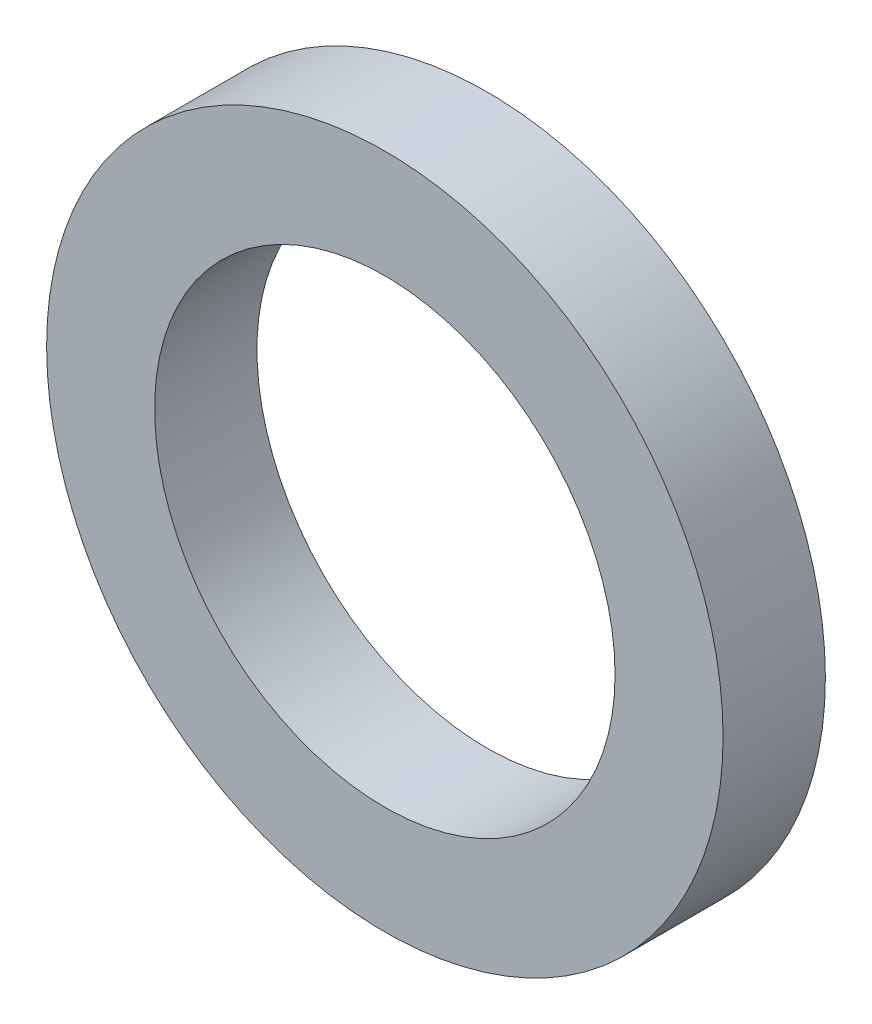
ISO-10303-21;
HEADER;
FILE_DESCRIPTION(('STEP AP214'),'2;1');
FILE_NAME('part.step','',(''),(''),'','','');
FILE_SCHEMA(('AUTOMOTIVE_DESIGN { 1 0 10303 214 1 1 1 1 }'));
ENDSEC;
DATA;
#1=APPLICATION_CONTEXT('core data for automotive mechanical design processes');
#2=APPLICATION_PROTOCOL_DEFINITION('international standard','automotive_design',2000,#1);
#3=PRODUCT_CONTEXT('',#1,'mechanical');
#4=PRODUCT('Part','Part','',(#3));
#5=PRODUCT_RELATED_PRODUCT_CATEGORY('part','',(#4));
#6=PRODUCT_DEFINITION_FORMATION('','',#4);
#7=PRODUCT_DEFINITION_CONTEXT('part definition',#1,'design');
#8=PRODUCT_DEFINITION('design','',#6,#7);
#9=PRODUCT_DEFINITION_SHAPE('','',#8);
#10=(LENGTH_UNIT() NAMED_UNIT(*) SI_UNIT(.MILLI.,.METRE.));
#11=(NAMED_UNIT(*) PLANE_ANGLE_UNIT() SI_UNIT($,.RADIAN.));
#12=(NAMED_UNIT(*) SI_UNIT($,.STERADIAN.) SOLID_ANGLE_UNIT());
#13=UNCERTAINTY_MEASURE_WITH_UNIT(LENGTH_MEASURE(1.E-05),#10,'distance_accuracy_value','');
#14=(GEOMETRIC_REPRESENTATION_CONTEXT(3) GLOBAL_UNCERTAINTY_ASSIGNED_CONTEXT((#13)) GLOBAL_UNIT_ASSIGNED_CONTEXT((#10,
#11,#12)) REPRESENTATION_CONTEXT('',''));
#15=CARTESIAN_POINT('',(0.,0.,0.));
#16=DIRECTION('',(0.,0.,1.));
#17=DIRECTION('',(1.,0.,0.));
#18=AXIS2_PLACEMENT_3D('',#15,#16,#17);
#19=CARTESIAN_POINT('',(0.,0.,28.575));
#20=DIRECTION('',(0.,0.,1.));
#21=DIRECTION('',(1.,0.,0.));
#22=AXIS2_PLACEMENT_3D('',#19,#20,#21);
#23=PLANE('',#22);
#24=CARTESIAN_POINT('',(0.,0.,28.575));
#25=DIRECTION('',(0.,0.,1.));
#26=DIRECTION('',(1.,0.,0.));
#27=AXIS2_PLACEMENT_3D('',#24,#25,#26);
#28=CIRCLE('',#27,188.9125);
#29=CARTESIAN_POINT('',(188.9125,0.,28.575));
#30=VERTEX_POINT('',#29);
#31=EDGE_CURVE('E10',#30,#30,#28,.T.);
#32=ORIENTED_EDGE('',*,*,#31,.T.);
#33=EDGE_LOOP('',(#32));
#34=FACE_BOUND('',#33,.T.);
#35=CARTESIAN_POINT('',(0.,0.,28.575));
#36=DIRECTION('',(0.,0.,1.));
#37=DIRECTION('',(1.,0.,0.));
#38=AXIS2_PLACEMENT_3D('',#35,#36,#37);
#39=CIRCLE('',#38,128.5875);
#40=CARTESIAN_POINT('',(128.5875,0.,28.575));
#41=VERTEX_POINT('',#40);
#42=EDGE_CURVE('E60',#41,#41,#39,.T.);
#43=ORIENTED_EDGE('',*,*,#42,.F.);
#44=EDGE_LOOP('',(#43));
#45=FACE_BOUND('',#44,.T.);
#46=ADVANCED_FACE('F47',(#34,#45),#23,.T.);
#47=CARTESIAN_POINT('',(0.,0.,-28.575));
#48=DIRECTION('',(0.,0.,1.));
#49=DIRECTION('',(1.,0.,0.));
#50=AXIS2_PLACEMENT_3D('',#47,#48,#49);
#51=PLANE('',#50);
#52=CARTESIAN_POINT('',(0.,0.,-28.575));
#53=DIRECTION('',(0.,0.,1.));
#54=DIRECTION('',(1.,0.,0.));
#55=AXIS2_PLACEMENT_3D('',#52,#53,#54);
#56=CIRCLE('',#55,188.9125);
#57=CARTESIAN_POINT('',(188.9125,0.,-28.575));
#58=VERTEX_POINT('',#57);
#59=EDGE_CURVE('E51',#58,#58,#56,.T.);
#60=ORIENTED_EDGE('',*,*,#59,.F.);
#61=EDGE_LOOP('',(#60));
#62=FACE_BOUND('',#61,.T.);
#63=CARTESIAN_POINT('',(0.,0.,-28.575));
#64=DIRECTION('',(0.,0.,1.));
#65=DIRECTION('',(1.,0.,0.));
#66=AXIS2_PLACEMENT_3D('',#63,#64,#65);
#67=CIRCLE('',#66,128.5875);
#68=CARTESIAN_POINT('',(128.5875,0.,-28.575));
#69=VERTEX_POINT('',#68);
#70=EDGE_CURVE('E62',#69,#69,#67,.T.);
#71=ORIENTED_EDGE('',*,*,#70,.T.);
#72=EDGE_LOOP('',(#71));
#73=FACE_BOUND('',#72,.T.);
#74=ADVANCED_FACE('F74',(#62,#73),#51,.F.);
#75=CARTESIAN_POINT('',(0.,0.,28.575));
#76=DIRECTION('',(0.,0.,-1.));
#77=DIRECTION('',(-1.,0.,0.));
#78=AXIS2_PLACEMENT_3D('',#75,#76,#77);
#79=CYLINDRICAL_SURFACE('',#78,188.9125);
#80=ORIENTED_EDGE('',*,*,#31,.F.);
#81=EDGE_LOOP('',(#80));
#82=FACE_BOUND('',#81,.T.);
#83=ORIENTED_EDGE('',*,*,#59,.T.);
#84=EDGE_LOOP('',(#83));
#85=FACE_BOUND('',#84,.T.);
#86=ADVANCED_FACE('F49',(#82,#85),#79,.T.);
#87=CARTESIAN_POINT('',(0.,0.,28.575));
#88=DIRECTION('',(0.,0.,-1.));
#89=DIRECTION('',(-1.,0.,0.));
#90=AXIS2_PLACEMENT_3D('',#87,#88,#89);
#91=CYLINDRICAL_SURFACE('',#90,128.5875);
#92=ORIENTED_EDGE('',*,*,#42,.T.);
#93=EDGE_LOOP('',(#92));
#94=FACE_BOUND('',#93,.T.);
#95=ORIENTED_EDGE('',*,*,#70,.F.);
#96=EDGE_LOOP('',(#95));
#97=FACE_BOUND('',#96,.T.);
#98=ADVANCED_FACE('F70',(#94,#97),#91,.F.);
#99=CLOSED_SHELL('',(#46,#74,#86,#98));
#100=MANIFOLD_SOLID_BREP('B2',#99);
#101=ADVANCED_BREP_SHAPE_REPRESENTATION('',(#18,#100),#14);
#102=SHAPE_DEFINITION_REPRESENTATION(#9,#101);
ENDSEC;
END-ISO-10303-21;
